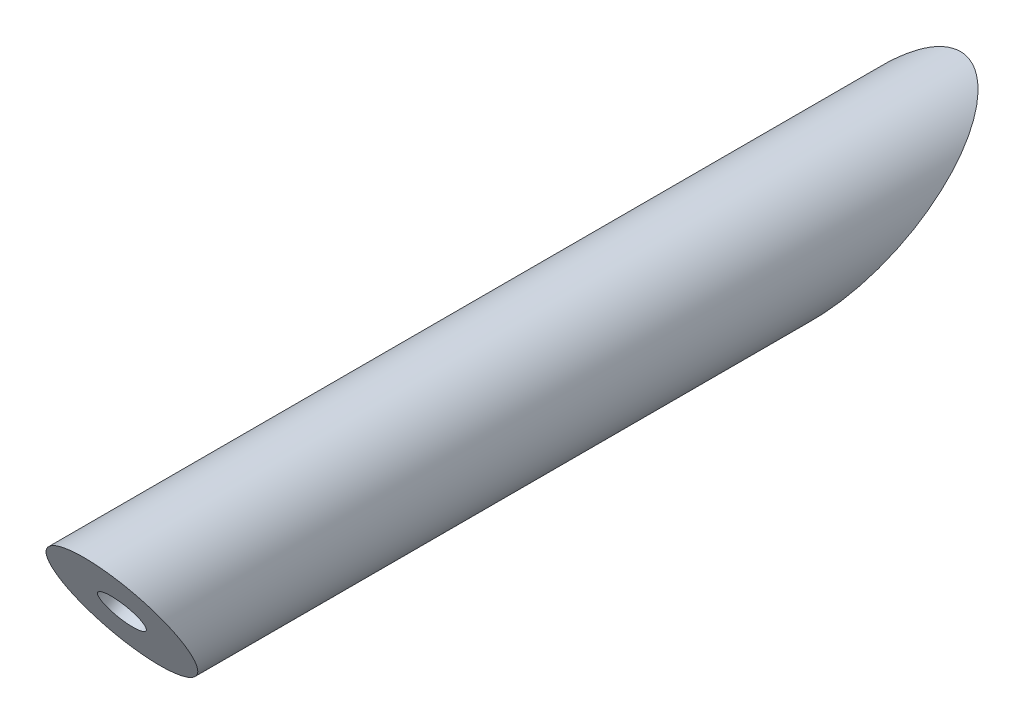
ISO-10303-21;
HEADER;
FILE_DESCRIPTION(('STEP AP214'),'2;1');
FILE_NAME('part.step','',(''),(''),'','','');
FILE_SCHEMA(('AUTOMOTIVE_DESIGN { 1 0 10303 214 1 1 1 1 }'));
ENDSEC;
DATA;
#1=APPLICATION_CONTEXT('core data for automotive mechanical design processes');
#2=APPLICATION_PROTOCOL_DEFINITION('international standard','automotive_design',2000,#1);
#3=PRODUCT_CONTEXT('',#1,'mechanical');
#4=PRODUCT('Part','Part','',(#3));
#5=PRODUCT_RELATED_PRODUCT_CATEGORY('part','',(#4));
#6=PRODUCT_DEFINITION_FORMATION('','',#4);
#7=PRODUCT_DEFINITION_CONTEXT('part definition',#1,'design');
#8=PRODUCT_DEFINITION('design','',#6,#7);
#9=PRODUCT_DEFINITION_SHAPE('','',#8);
#10=(LENGTH_UNIT() NAMED_UNIT(*) SI_UNIT(.MILLI.,.METRE.));
#11=(NAMED_UNIT(*) PLANE_ANGLE_UNIT() SI_UNIT($,.RADIAN.));
#12=(NAMED_UNIT(*) SI_UNIT($,.STERADIAN.) SOLID_ANGLE_UNIT());
#13=UNCERTAINTY_MEASURE_WITH_UNIT(LENGTH_MEASURE(1.E-05),#10,'distance_accuracy_value','');
#14=(GEOMETRIC_REPRESENTATION_CONTEXT(3) GLOBAL_UNCERTAINTY_ASSIGNED_CONTEXT((#13)) GLOBAL_UNIT_ASSIGNED_CONTEXT((#10,
#11,#12)) REPRESENTATION_CONTEXT('',''));
#15=CARTESIAN_POINT('',(0.,0.,0.));
#16=DIRECTION('',(0.,0.,1.));
#17=DIRECTION('',(1.,0.,0.));
#18=AXIS2_PLACEMENT_3D('',#15,#16,#17);
#19=CARTESIAN_POINT('',(0.,0.,100.));
#20=DIRECTION('',(0.,0.,-1.));
#21=DIRECTION('',(-1.,0.,0.));
#22=AXIS2_PLACEMENT_3D('',#19,#20,#21);
#23=CYLINDRICAL_SURFACE('',#22,7.5);
#24=CARTESIAN_POINT('',(0.,0.,95.6698729810778));
#25=DIRECTION('',(0.,0.500000000000004,-0.866025403784436));
#26=DIRECTION('',(0.,-0.866025403784436,-0.500000000000004));
#27=AXIS2_PLACEMENT_3D('',#24,#25,#26);
#28=ELLIPSE('',#27,8.66025403784441,7.5);
#29=CARTESIAN_POINT('',(0.,-7.5,91.3397459621555));
#30=VERTEX_POINT('',#29);
#31=EDGE_CURVE('E10',#30,#30,#28,.T.);
#32=ORIENTED_EDGE('',*,*,#31,.T.);
#33=EDGE_LOOP('',(#32));
#34=FACE_BOUND('',#33,.T.);
#35=CARTESIAN_POINT('',(0.,0.,12.9903810567666));
#36=DIRECTION('',(0.,0.866025403784439,0.5));
#37=DIRECTION('',(0.,0.5,-0.866025403784439));
#38=AXIS2_PLACEMENT_3D('',#35,#36,#37);
#39=ELLIPSE('',#38,15.,7.5);
#40=CARTESIAN_POINT('',(0.,7.5,0.));
#41=VERTEX_POINT('',#40);
#42=EDGE_CURVE('E37',#41,#41,#39,.T.);
#43=ORIENTED_EDGE('',*,*,#42,.T.);
#44=EDGE_LOOP('',(#43));
#45=FACE_BOUND('',#44,.T.);
#46=ADVANCED_FACE('F31',(#34,#45),#23,.T.);
#47=CARTESIAN_POINT('',(-7.5,7.5,0.));
#48=DIRECTION('',(0.,0.866025403784439,0.5));
#49=DIRECTION('',(0.,-0.5,0.866025403784439));
#50=AXIS2_PLACEMENT_3D('',#47,#48,#49);
#51=PLANE('',#50);
#52=CARTESIAN_POINT('',(0.,0.,12.9903810567666));
#53=DIRECTION('',(0.,-0.866025403784439,-0.5));
#54=DIRECTION('',(0.,0.5,-0.866025403784439));
#55=AXIS2_PLACEMENT_3D('',#52,#53,#54);
#56=CIRCLE('',#55,2.5);
#57=CARTESIAN_POINT('',(0.,1.25,10.8253175473055));
#58=VERTEX_POINT('',#57);
#59=EDGE_CURVE('E51',#58,#58,#56,.T.);
#60=ORIENTED_EDGE('',*,*,#59,.F.);
#61=EDGE_LOOP('',(#60));
#62=FACE_BOUND('',#61,.T.);
#63=ORIENTED_EDGE('',*,*,#42,.F.);
#64=EDGE_LOOP('',(#63));
#65=FACE_BOUND('',#64,.T.);
#66=ADVANCED_FACE('F66',(#62,#65),#51,.F.);
#67=CARTESIAN_POINT('',(-7.5,7.5,100.));
#68=DIRECTION('',(0.,0.500000000000004,-0.866025403784436));
#69=DIRECTION('',(0.,0.866025403784436,0.500000000000004));
#70=AXIS2_PLACEMENT_3D('',#67,#68,#69);
#71=PLANE('',#70);
#72=CARTESIAN_POINT('',(0.,0.,95.6698729810778));
#73=DIRECTION('',(0.,-0.500000000000004,0.866025403784436));
#74=DIRECTION('',(0.,-0.866025403784436,-0.500000000000005));
#75=AXIS2_PLACEMENT_3D('',#72,#73,#74);
#76=CIRCLE('',#75,2.5);
#77=CARTESIAN_POINT('',(0.,-2.1650635094611,94.4198729810778));
#78=VERTEX_POINT('',#77);
#79=EDGE_CURVE('E45',#78,#78,#76,.T.);
#80=ORIENTED_EDGE('',*,*,#79,.F.);
#81=EDGE_LOOP('',(#80));
#82=FACE_BOUND('',#81,.T.);
#83=ORIENTED_EDGE('',*,*,#31,.F.);
#84=EDGE_LOOP('',(#83));
#85=FACE_BOUND('',#84,.T.);
#86=ADVANCED_FACE('F69',(#82,#85),#71,.F.);
#87=CARTESIAN_POINT('',(0.,5.00000000000004,87.0096189432334));
#88=DIRECTION('',(0.,-0.500000000000004,0.866025403784436));
#89=DIRECTION('',(0.,-0.866025403784436,-0.500000000000005));
#90=AXIS2_PLACEMENT_3D('',#87,#88,#89);
#91=CYLINDRICAL_SURFACE('',#90,2.5);
#92=CARTESIAN_POINT('',(0.,5.00000000000004,87.0096189432334));
#93=DIRECTION('',(0.,-0.500000000000004,0.866025403784436));
#94=DIRECTION('',(0.,-0.866025403784436,-0.500000000000005));
#95=AXIS2_PLACEMENT_3D('',#92,#93,#94);
#96=CIRCLE('',#95,2.5);
#97=CARTESIAN_POINT('',(0.,2.83493649053894,85.7596189432334));
#98=VERTEX_POINT('',#97);
#99=EDGE_CURVE('E41',#98,#98,#96,.T.);
#100=CARTESIAN_POINT('',(0.,2.83493649053894,85.7596189432334));
#101=CARTESIAN_POINT('',(0.,2.78285315720561,85.8498299227943));
#102=CARTESIAN_POINT('',(0.,2.73076982387228,85.9400409023552));
#103=CARTESIAN_POINT('',(0.,2.62660315720561,86.1204628614769));
#104=CARTESIAN_POINT('',(0.,2.57451982387227,86.2106738410378));
#105=CARTESIAN_POINT('',(0.,2.47035315720561,86.3910958001596));
#106=CARTESIAN_POINT('',(0.,2.41826982387227,86.4813067797205));
#107=CARTESIAN_POINT('',(0.,2.3141031572056,86.6617287388422));
#108=CARTESIAN_POINT('',(0.,2.26201982387227,86.7519397184031));
#109=CARTESIAN_POINT('',(0.,2.1578531572056,86.9323616775249));
#110=CARTESIAN_POINT('',(0.,2.10576982387227,87.0225726570857));
#111=CARTESIAN_POINT('',(0.,2.0016031572056,87.2029946162075));
#112=CARTESIAN_POINT('',(0.,1.94951982387227,87.2932055957684));
#113=CARTESIAN_POINT('',(0.,1.8453531572056,87.4736275548901));
#114=CARTESIAN_POINT('',(0.,1.79326982387227,87.563838534451));
#115=CARTESIAN_POINT('',(0.,1.6891031572056,87.7442604935728));
#116=CARTESIAN_POINT('',(0.,1.63701982387227,87.8344714731336));
#117=CARTESIAN_POINT('',(0.,1.5328531572056,88.0148934322554));
#118=CARTESIAN_POINT('',(0.,1.48076982387226,88.1051044118163));
#119=CARTESIAN_POINT('',(0.,1.3766031572056,88.285526370938));
#120=CARTESIAN_POINT('',(0.,1.32451982387226,88.3757373504989));
#121=CARTESIAN_POINT('',(0.,1.2203531572056,88.5561593096207));
#122=CARTESIAN_POINT('',(0.,1.16826982387226,88.6463702891815));
#123=CARTESIAN_POINT('',(0.,1.0641031572056,88.8267922483033));
#124=CARTESIAN_POINT('',(0.,1.01201982387226,88.9170032278642));
#125=CARTESIAN_POINT('',(0.,0.907853157205594,89.0974251869859));
#126=CARTESIAN_POINT('',(0.,0.855769823872259,89.1876361665468));
#127=CARTESIAN_POINT('',(0.,0.75160315720559,89.3680581256686));
#128=CARTESIAN_POINT('',(0.,0.699519823872258,89.4582691052294));
#129=CARTESIAN_POINT('',(0.,0.595353157205591,89.6386910643512));
#130=CARTESIAN_POINT('',(0.,0.543269823872257,89.7289020439121));
#131=CARTESIAN_POINT('',(0.,0.439103157205589,89.9093240030338));
#132=CARTESIAN_POINT('',(0.,0.387019823872256,89.9995349825947));
#133=CARTESIAN_POINT('',(0.,0.282853157205588,90.1799569417165));
#134=CARTESIAN_POINT('',(0.,0.230769823872254,90.2701679212774));
#135=CARTESIAN_POINT('',(0.,0.126603157205587,90.4505898803991));
#136=CARTESIAN_POINT('',(0.,0.0745198238722539,90.54080085996));
#137=CARTESIAN_POINT('',(0.,-0.0296468427944144,90.7212228190817));
#138=CARTESIAN_POINT('',(0.,-0.0817301761277497,90.8114337986426));
#139=CARTESIAN_POINT('',(0.,-0.185896842794418,90.9918557577644));
#140=CARTESIAN_POINT('',(0.,-0.23798017612775,91.0820667373253));
#141=CARTESIAN_POINT('',(0.,-0.342146842794417,91.262488696447));
#142=CARTESIAN_POINT('',(0.,-0.394230176127751,91.3526996760079));
#143=CARTESIAN_POINT('',(0.,-0.498396842794419,91.5331216351297));
#144=CARTESIAN_POINT('',(0.,-0.550480176127752,91.6233326146905));
#145=CARTESIAN_POINT('',(0.,-0.65464684279442,91.8037545738123));
#146=CARTESIAN_POINT('',(0.,-0.706730176127754,91.8939655533732));
#147=CARTESIAN_POINT('',(0.,-0.810896842794422,92.0743875124949));
#148=CARTESIAN_POINT('',(0.,-0.862980176127756,92.1645984920558));
#149=CARTESIAN_POINT('',(0.,-0.967146842794423,92.3450204511776));
#150=CARTESIAN_POINT('',(0.,-1.01923017612776,92.4352314307385));
#151=CARTESIAN_POINT('',(0.,-1.12339684279442,92.6156533898602));
#152=CARTESIAN_POINT('',(0.,-1.17548017612776,92.7058643694211));
#153=CARTESIAN_POINT('',(0.,-1.27964684279443,92.8862863285428));
#154=CARTESIAN_POINT('',(0.,-1.33173017612776,92.9764973081037));
#155=CARTESIAN_POINT('',(0.,-1.43589684279443,93.1569192672255));
#156=CARTESIAN_POINT('',(0.,-1.48798017612776,93.2471302467864));
#157=CARTESIAN_POINT('',(0.,-1.59214684279443,93.4275522059081));
#158=CARTESIAN_POINT('',(0.,-1.64423017612776,93.517763185469));
#159=CARTESIAN_POINT('',(0.,-1.74839684279443,93.6981851445908));
#160=CARTESIAN_POINT('',(0.,-1.80048017612776,93.7883961241516));
#161=CARTESIAN_POINT('',(0.,-1.90464684279443,93.9688180832734));
#162=CARTESIAN_POINT('',(0.,-1.95673017612776,94.0590290628343));
#163=CARTESIAN_POINT('',(0.,-2.06089684279443,94.239451021956));
#164=CARTESIAN_POINT('',(0.,-2.11298017612777,94.3296620015169));
#165=CARTESIAN_POINT('',(0.,-2.1650635094611,94.4198729810778));
#166=B_SPLINE_CURVE_WITH_KNOTS('',3,(#100,#101,#102,#103,#104,#105,#106,#107,#108,#109,#110,
#111,#112,#113,#114,#115,#116,#117,#118,#119,#120,#121,#122,#123,#124,#125,#126,#127,#128,#129,
#130,#131,#132,#133,#134,#135,#136,#137,#138,#139,#140,#141,#142,#143,#144,#145,#146,#147,#148,
#149,#150,#151,#152,#153,#154,#155,#156,#157,#158,#159,#160,#161,#162,#163,#164,#165),
.UNSPECIFIED.,.F.,.F.,(4,2,2,2,2,2,2,2,2,2,2,2,2,2,2,2,2,2,2,2,2,2,2,2,2,2,2,2,2,2,2,2,4),(0.,
0.312500000000002,0.625000000000004,0.937500000000006,1.25000000000001,1.56250000000001,
1.87500000000001,2.1875,2.5,2.8125,3.12500000000001,3.43750000000001,3.75000000000001,4.0625,
4.375,4.6875,5.00000000000001,5.31250000000001,5.62500000000001,5.9375,6.25,6.5625,
6.87500000000001,7.18750000000001,7.50000000000001,7.81250000000001,8.125,8.4375,8.75,
9.06250000000001,9.37500000000001,9.68750000000001,10.),.UNSPECIFIED.);
#167=EDGE_CURVE('BSEAM74',#98,#78,#166,.T.);
#168=ORIENTED_EDGE('',*,*,#99,.F.);
#169=ORIENTED_EDGE('',*,*,#79,.T.);
#170=ORIENTED_EDGE('',*,*,#167,.T.);
#171=ORIENTED_EDGE('',*,*,#167,.F.);
#172=EDGE_LOOP('',(#168,#170,#169,#171));
#173=FACE_BOUND('',#172,.T.);
#174=ADVANCED_FACE('F74',(#173),#91,.F.);
#175=CARTESIAN_POINT('',(0.,5.00000000000004,87.0096189432334));
#176=DIRECTION('',(0.,-0.500000000000004,0.866025403784436));
#177=DIRECTION('',(0.,-0.866025403784436,-0.500000000000005));
#178=AXIS2_PLACEMENT_3D('',#175,#176,#177);
#179=PLANE('',#178);
#180=ORIENTED_EDGE('',*,*,#99,.T.);
#181=EDGE_LOOP('',(#180));
#182=FACE_BOUND('',#181,.T.);
#183=ADVANCED_FACE('F62',(#182),#179,.T.);
#184=CARTESIAN_POINT('',(0.,4.3301270189222,15.4903810567666));
#185=DIRECTION('',(0.,-0.866025403784439,-0.5));
#186=DIRECTION('',(0.,0.5,-0.866025403784439));
#187=AXIS2_PLACEMENT_3D('',#184,#185,#186);
#188=CYLINDRICAL_SURFACE('',#187,2.5);
#189=CARTESIAN_POINT('',(0.,4.3301270189222,15.4903810567666));
#190=DIRECTION('',(0.,-0.866025403784439,-0.5));
#191=DIRECTION('',(0.,0.5,-0.866025403784439));
#192=AXIS2_PLACEMENT_3D('',#189,#190,#191);
#193=CIRCLE('',#192,2.5);
#194=CARTESIAN_POINT('',(0.,5.5801270189222,13.3253175473055));
#195=VERTEX_POINT('',#194);
#196=EDGE_CURVE('E49',#195,#195,#193,.T.);
#197=CARTESIAN_POINT('',(0.,5.5801270189222,13.3253175473055));
#198=CARTESIAN_POINT('',(0.,5.53502152914176,13.2992758806388));
#199=CARTESIAN_POINT('',(0.,5.48991603936132,13.2732342139721));
#200=CARTESIAN_POINT('',(0.,5.39970505980044,13.2211508806388));
#201=CARTESIAN_POINT('',(0.,5.35459957002,13.1951092139721));
#202=CARTESIAN_POINT('',(0.,5.26438859045912,13.1430258806388));
#203=CARTESIAN_POINT('',(0.,5.21928310067868,13.1169842139721));
#204=CARTESIAN_POINT('',(0.,5.1290721211178,13.0649008806388));
#205=CARTESIAN_POINT('',(0.,5.08396663133736,13.0388592139721));
#206=CARTESIAN_POINT('',(0.,4.99375565177649,12.9867758806388));
#207=CARTESIAN_POINT('',(0.,4.94865016199604,12.9607342139721));
#208=CARTESIAN_POINT('',(0.,4.85843918243517,12.9086508806388));
#209=CARTESIAN_POINT('',(0.,4.81333369265473,12.8826092139721));
#210=CARTESIAN_POINT('',(0.,4.72312271309385,12.8305258806388));
#211=CARTESIAN_POINT('',(0.,4.67801722331341,12.8044842139721));
#212=CARTESIAN_POINT('',(0.,4.58780624375253,12.7524008806388));
#213=CARTESIAN_POINT('',(0.,4.54270075397209,12.7263592139721));
#214=CARTESIAN_POINT('',(0.,4.45248977441121,12.6742758806388));
#215=CARTESIAN_POINT('',(0.,4.40738428463077,12.6482342139721));
#216=CARTESIAN_POINT('',(0.,4.31717330506989,12.5961508806388));
#217=CARTESIAN_POINT('',(0.,4.27206781528945,12.5701092139721));
#218=CARTESIAN_POINT('',(0.,4.18185683572857,12.5180258806388));
#219=CARTESIAN_POINT('',(0.,4.13675134594813,12.4919842139721));
#220=CARTESIAN_POINT('',(0.,4.04654036638726,12.4399008806388));
#221=CARTESIAN_POINT('',(0.,4.00143487660682,12.4138592139721));
#222=CARTESIAN_POINT('',(0.,3.91122389704594,12.3617758806388));
#223=CARTESIAN_POINT('',(0.,3.8661184072655,12.3357342139721));
#224=CARTESIAN_POINT('',(0.,3.77590742770462,12.2836508806388));
#225=CARTESIAN_POINT('',(0.,3.73080193792418,12.2576092139721));
#226=CARTESIAN_POINT('',(0.,3.6405909583633,12.2055258806388));
#227=CARTESIAN_POINT('',(0.,3.59548546858286,12.1794842139721));
#228=CARTESIAN_POINT('',(0.,3.50527448902198,12.1274008806388));
#229=CARTESIAN_POINT('',(0.,3.46016899924154,12.1013592139721));
#230=CARTESIAN_POINT('',(0.,3.36995801968066,12.0492758806388));
#231=CARTESIAN_POINT('',(0.,3.32485252990022,12.0232342139721));
#232=CARTESIAN_POINT('',(0.,3.23464155033934,11.9711508806388));
#233=CARTESIAN_POINT('',(0.,3.1895360605589,11.9451092139721));
#234=CARTESIAN_POINT('',(0.,3.09932508099803,11.8930258806388));
#235=CARTESIAN_POINT('',(0.,3.05421959121759,11.8669842139721));
#236=CARTESIAN_POINT('',(0.,2.96400861165671,11.8149008806388));
#237=CARTESIAN_POINT('',(0.,2.91890312187627,11.7888592139721));
#238=CARTESIAN_POINT('',(0.,2.82869214231539,11.7367758806388));
#239=CARTESIAN_POINT('',(0.,2.78358665253495,11.7107342139721));
#240=CARTESIAN_POINT('',(0.,2.69337567297407,11.6586508806388));
#241=CARTESIAN_POINT('',(0.,2.64827018319363,11.6326092139721));
#242=CARTESIAN_POINT('',(0.,2.55805920363275,11.5805258806388));
#243=CARTESIAN_POINT('',(0.,2.51295371385231,11.5544842139721));
#244=CARTESIAN_POINT('',(0.,2.42274273429143,11.5024008806388));
#245=CARTESIAN_POINT('',(0.,2.37763724451099,11.4763592139721));
#246=CARTESIAN_POINT('',(0.,2.28742626495011,11.4242758806388));
#247=CARTESIAN_POINT('',(0.,2.24232077516967,11.3982342139721));
#248=CARTESIAN_POINT('',(0.,2.1521097956088,11.3461508806388));
#249=CARTESIAN_POINT('',(0.,2.10700430582836,11.3201092139721));
#250=CARTESIAN_POINT('',(0.,2.01679332626748,11.2680258806388));
#251=CARTESIAN_POINT('',(0.,1.97168783648704,11.2419842139721));
#252=CARTESIAN_POINT('',(0.,1.88147685692616,11.1899008806388));
#253=CARTESIAN_POINT('',(0.,1.83637136714572,11.1638592139721));
#254=CARTESIAN_POINT('',(0.,1.74616038758484,11.1117758806388));
#255=CARTESIAN_POINT('',(0.,1.7010548978044,11.0857342139721));
#256=CARTESIAN_POINT('',(0.,1.61084391824352,11.0336508806388));
#257=CARTESIAN_POINT('',(0.,1.56573842846308,11.0076092139721));
#258=CARTESIAN_POINT('',(0.,1.4755274489022,10.9555258806388));
#259=CARTESIAN_POINT('',(0.,1.43042195912176,10.9294842139721));
#260=CARTESIAN_POINT('',(0.,1.34021097956088,10.8774008806388));
#261=CARTESIAN_POINT('',(0.,1.29510548978044,10.8513592139721));
#262=CARTESIAN_POINT('',(0.,1.25,10.8253175473055));
#263=B_SPLINE_CURVE_WITH_KNOTS('',3,(#197,#198,#199,#200,#201,#202,#203,#204,#205,#206,#207,
#208,#209,#210,#211,#212,#213,#214,#215,#216,#217,#218,#219,#220,#221,#222,#223,#224,#225,#226,
#227,#228,#229,#230,#231,#232,#233,#234,#235,#236,#237,#238,#239,#240,#241,#242,#243,#244,#245,
#246,#247,#248,#249,#250,#251,#252,#253,#254,#255,#256,#257,#258,#259,#260,#261,#262),
.UNSPECIFIED.,.F.,.F.,(4,2,2,2,2,2,2,2,2,2,2,2,2,2,2,2,2,2,2,2,2,2,2,2,2,2,2,2,2,2,2,2,4),(0.,
0.15625,0.3125,0.46875,0.624999999999999,0.78125,0.9375,1.09375,1.25,1.40625,1.5625,1.71875,
1.875,2.03125,2.1875,2.34375,2.5,2.65625,2.8125,2.96875,3.125,3.28125,3.4375,3.59375,3.75,
3.90625,4.0625,4.21875,4.375,4.53125,4.6875,4.84375,5.),.UNSPECIFIED.);
#264=EDGE_CURVE('BSEAM59',#195,#58,#263,.T.);
#265=ORIENTED_EDGE('',*,*,#196,.F.);
#266=ORIENTED_EDGE('',*,*,#59,.T.);
#267=ORIENTED_EDGE('',*,*,#264,.T.);
#268=ORIENTED_EDGE('',*,*,#264,.F.);
#269=EDGE_LOOP('',(#265,#267,#266,#268));
#270=FACE_BOUND('',#269,.T.);
#271=ADVANCED_FACE('F59',(#270),#188,.F.);
#272=CARTESIAN_POINT('',(0.,4.3301270189222,15.4903810567666));
#273=DIRECTION('',(0.,-0.866025403784439,-0.5));
#274=DIRECTION('',(0.,0.5,-0.866025403784439));
#275=AXIS2_PLACEMENT_3D('',#272,#273,#274);
#276=PLANE('',#275);
#277=ORIENTED_EDGE('',*,*,#196,.T.);
#278=EDGE_LOOP('',(#277));
#279=FACE_BOUND('',#278,.T.);
#280=ADVANCED_FACE('F57',(#279),#276,.T.);
#281=CLOSED_SHELL('',(#46,#66,#86,#174,#183,#271,#280));
#282=MANIFOLD_SOLID_BREP('B2',#281);
#283=ADVANCED_BREP_SHAPE_REPRESENTATION('',(#18,#282),#14);
#284=SHAPE_DEFINITION_REPRESENTATION(#9,#283);
ENDSEC;
END-ISO-10303-21;
